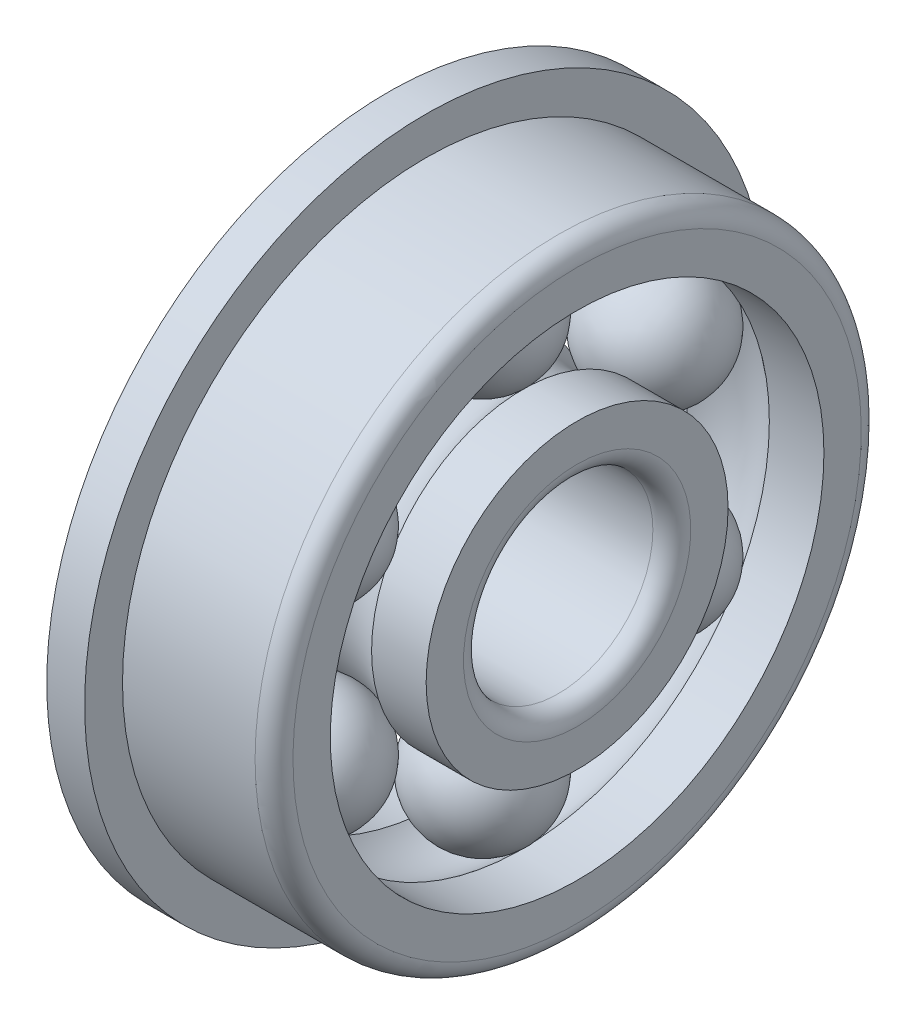
ISO-10303-21;
HEADER;
FILE_DESCRIPTION(('STEP AP214'),'2;1');
FILE_NAME('part.step','',(''),(''),'','','');
FILE_SCHEMA(('AUTOMOTIVE_DESIGN { 1 0 10303 214 1 1 1 1 }'));
ENDSEC;
DATA;
#1=APPLICATION_CONTEXT('core data for automotive mechanical design processes');
#2=APPLICATION_PROTOCOL_DEFINITION('international standard','automotive_design',2000,#1);
#3=PRODUCT_CONTEXT('',#1,'mechanical');
#4=PRODUCT('Part','Part','',(#3));
#5=PRODUCT_RELATED_PRODUCT_CATEGORY('part','',(#4));
#6=PRODUCT_DEFINITION_FORMATION('','',#4);
#7=PRODUCT_DEFINITION_CONTEXT('part definition',#1,'design');
#8=PRODUCT_DEFINITION('design','',#6,#7);
#9=PRODUCT_DEFINITION_SHAPE('','',#8);
#10=(LENGTH_UNIT() NAMED_UNIT(*) SI_UNIT(.MILLI.,.METRE.));
#11=(NAMED_UNIT(*) PLANE_ANGLE_UNIT() SI_UNIT($,.RADIAN.));
#12=(NAMED_UNIT(*) SI_UNIT($,.STERADIAN.) SOLID_ANGLE_UNIT());
#13=UNCERTAINTY_MEASURE_WITH_UNIT(LENGTH_MEASURE(1.E-05),#10,'distance_accuracy_value','');
#14=(GEOMETRIC_REPRESENTATION_CONTEXT(3) GLOBAL_UNCERTAINTY_ASSIGNED_CONTEXT((#13)) GLOBAL_UNIT_ASSIGNED_CONTEXT((#10,
#11,#12)) REPRESENTATION_CONTEXT('',''));
#15=CARTESIAN_POINT('',(0.,0.,0.));
#16=DIRECTION('',(0.,0.,1.));
#17=DIRECTION('',(1.,0.,0.));
#18=AXIS2_PLACEMENT_3D('',#15,#16,#17);
#19=CARTESIAN_POINT('',(0.,2.625,4.54663336986831));
#20=DIRECTION('',(1.,0.,0.));
#21=DIRECTION('',(0.,-0.866025403784439,0.499999999999999));
#22=AXIS2_PLACEMENT_3D('',#19,#20,#21);
#23=SPHERICAL_SURFACE('',#22,1.65);
#24=CARTESIAN_POINT('',(-1.64999999999999,2.625,4.54663336986831));
#25=VERTEX_POINT('',#24);
#26=VERTEX_LOOP('',#25);
#27=FACE_BOUND('',#26,.T.);
#28=CARTESIAN_POINT('',(1.65000000000001,2.625,4.54663336986831));
#29=VERTEX_POINT('',#28);
#30=VERTEX_LOOP('',#29);
#31=FACE_BOUND('',#30,.T.);
#32=ADVANCED_FACE('P0_F15',(#27,#31),#23,.T.);
#33=CLOSED_SHELL('',(#32));
#34=MANIFOLD_SOLID_BREP('P0_B1',#33);
#35=CARTESIAN_POINT('',(0.,-2.625,4.5466333698683));
#36=DIRECTION('',(1.,0.,0.));
#37=DIRECTION('',(0.,-0.866025403784438,-0.5));
#38=AXIS2_PLACEMENT_3D('',#35,#36,#37);
#39=SPHERICAL_SURFACE('',#38,1.65);
#40=CARTESIAN_POINT('',(-1.64999999999999,-2.625,4.5466333698683));
#41=VERTEX_POINT('',#40);
#42=VERTEX_LOOP('',#41);
#43=FACE_BOUND('',#42,.T.);
#44=CARTESIAN_POINT('',(1.65000000000001,-2.625,4.5466333698683));
#45=VERTEX_POINT('',#44);
#46=VERTEX_LOOP('',#45);
#47=FACE_BOUND('',#46,.T.);
#48=ADVANCED_FACE('P1_F15',(#43,#47),#39,.T.);
#49=CLOSED_SHELL('',(#48));
#50=MANIFOLD_SOLID_BREP('P1_B1',#49);
#51=CARTESIAN_POINT('',(0.,-5.25,0.));
#52=DIRECTION('',(1.,0.,0.));
#53=DIRECTION('',(0.,0.,-1.));
#54=AXIS2_PLACEMENT_3D('',#51,#52,#53);
#55=SPHERICAL_SURFACE('',#54,1.65);
#56=CARTESIAN_POINT('',(-1.64999999999999,-5.25,0.));
#57=VERTEX_POINT('',#56);
#58=VERTEX_LOOP('',#57);
#59=FACE_BOUND('',#58,.T.);
#60=CARTESIAN_POINT('',(1.65000000000001,-5.25,0.));
#61=VERTEX_POINT('',#60);
#62=VERTEX_LOOP('',#61);
#63=FACE_BOUND('',#62,.T.);
#64=ADVANCED_FACE('P2_F15',(#59,#63),#55,.T.);
#65=CLOSED_SHELL('',(#64));
#66=MANIFOLD_SOLID_BREP('P2_B1',#65);
#67=CARTESIAN_POINT('',(0.,-2.625,-4.5466333698683));
#68=DIRECTION('',(1.,0.,0.));
#69=DIRECTION('',(0.,0.866025403784439,-0.5));
#70=AXIS2_PLACEMENT_3D('',#67,#68,#69);
#71=SPHERICAL_SURFACE('',#70,1.65);
#72=CARTESIAN_POINT('',(-1.64999999999999,-2.625,-4.5466333698683));
#73=VERTEX_POINT('',#72);
#74=VERTEX_LOOP('',#73);
#75=FACE_BOUND('',#74,.T.);
#76=CARTESIAN_POINT('',(1.65000000000001,-2.625,-4.5466333698683));
#77=VERTEX_POINT('',#76);
#78=VERTEX_LOOP('',#77);
#79=FACE_BOUND('',#78,.T.);
#80=ADVANCED_FACE('P3_F15',(#75,#79),#71,.T.);
#81=CLOSED_SHELL('',(#80));
#82=MANIFOLD_SOLID_BREP('P3_B1',#81);
#83=CARTESIAN_POINT('',(0.,2.625,-4.5466333698683));
#84=DIRECTION('',(1.,0.,0.));
#85=DIRECTION('',(0.,0.866025403784439,0.5));
#86=AXIS2_PLACEMENT_3D('',#83,#84,#85);
#87=SPHERICAL_SURFACE('',#86,1.65);
#88=CARTESIAN_POINT('',(-1.64999999999999,2.625,-4.5466333698683));
#89=VERTEX_POINT('',#88);
#90=VERTEX_LOOP('',#89);
#91=FACE_BOUND('',#90,.T.);
#92=CARTESIAN_POINT('',(1.65000000000001,2.625,-4.5466333698683));
#93=VERTEX_POINT('',#92);
#94=VERTEX_LOOP('',#93);
#95=FACE_BOUND('',#94,.T.);
#96=ADVANCED_FACE('P4_F15',(#91,#95),#87,.T.);
#97=CLOSED_SHELL('',(#96));
#98=MANIFOLD_SOLID_BREP('P4_B1',#97);
#99=CARTESIAN_POINT('',(0.,5.25,0.));
#100=DIRECTION('',(1.,0.,0.));
#101=DIRECTION('',(0.,0.,1.));
#102=AXIS2_PLACEMENT_3D('',#99,#100,#101);
#103=SPHERICAL_SURFACE('',#102,1.65);
#104=CARTESIAN_POINT('',(-1.64999999999999,5.25,0.));
#105=VERTEX_POINT('',#104);
#106=VERTEX_LOOP('',#105);
#107=FACE_BOUND('',#106,.T.);
#108=CARTESIAN_POINT('',(1.65000000000001,5.25,0.));
#109=VERTEX_POINT('',#108);
#110=VERTEX_LOOP('',#109);
#111=FACE_BOUND('',#110,.T.);
#112=ADVANCED_FACE('P5_F15',(#107,#111),#103,.T.);
#113=CLOSED_SHELL('',(#112));
#114=MANIFOLD_SOLID_BREP('P5_B1',#113);
#115=CARTESIAN_POINT('',(0.,0.,0.));
#116=DIRECTION('',(1.,0.,0.));
#117=DIRECTION('',(0.,1.,0.));
#118=AXIS2_PLACEMENT_3D('',#115,#116,#117);
#119=TOROIDAL_SURFACE('',#118,5.25,1.65);
#120=CARTESIAN_POINT('',(-1.0593748156342,0.,0.));
#121=DIRECTION('',(1.,0.,0.));
#122=DIRECTION('',(0.,0.,-1.));
#123=AXIS2_PLACEMENT_3D('',#120,#121,#122);
#124=CIRCLE('',#123,6.515);
#125=CARTESIAN_POINT('',(-1.0593748156342,0.,-6.515));
#126=VERTEX_POINT('',#125);
#127=EDGE_CURVE('P6_E46',#126,#126,#124,.F.);
#128=ORIENTED_EDGE('',*,*,#127,.T.);
#129=EDGE_LOOP('',(#128));
#130=FACE_BOUND('',#129,.T.);
#131=CARTESIAN_POINT('',(1.0593748156342,0.,0.));
#132=DIRECTION('',(1.,0.,0.));
#133=DIRECTION('',(0.,0.,-1.));
#134=AXIS2_PLACEMENT_3D('',#131,#132,#133);
#135=CIRCLE('',#134,6.515);
#136=CARTESIAN_POINT('',(1.0593748156342,0.,-6.515));
#137=VERTEX_POINT('',#136);
#138=EDGE_CURVE('P6_E42',#137,#137,#135,.T.);
#139=ORIENTED_EDGE('',*,*,#138,.T.);
#140=EDGE_LOOP('',(#139));
#141=FACE_BOUND('',#140,.T.);
#142=ADVANCED_FACE('P6_F14',(#130,#141),#119,.F.);
#143=CARTESIAN_POINT('',(2.50000000000003,0.,0.));
#144=DIRECTION('',(1.,0.,0.));
#145=DIRECTION('',(0.,0.,-1.));
#146=AXIS2_PLACEMENT_3D('',#143,#144,#145);
#147=CYLINDRICAL_SURFACE('',#146,6.515);
#148=CARTESIAN_POINT('',(-2.49999999999998,0.,0.));
#149=DIRECTION('',(1.,0.,0.));
#150=DIRECTION('',(0.,0.,-1.));
#151=AXIS2_PLACEMENT_3D('',#148,#149,#150);
#152=CIRCLE('',#151,6.515);
#153=CARTESIAN_POINT('',(-2.49999999999998,0.,-6.515));
#154=VERTEX_POINT('',#153);
#155=EDGE_CURVE('P6_E18',#154,#154,#152,.T.);
#156=ORIENTED_EDGE('',*,*,#155,.F.);
#157=EDGE_LOOP('',(#156));
#158=FACE_BOUND('',#157,.T.);
#159=ORIENTED_EDGE('',*,*,#127,.F.);
#160=EDGE_LOOP('',(#159));
#161=FACE_BOUND('',#160,.T.);
#162=ADVANCED_FACE('P6_F100',(#158,#161),#147,.F.);
#163=CARTESIAN_POINT('',(2.50000000000003,0.,0.));
#164=DIRECTION('',(1.,0.,0.));
#165=DIRECTION('',(0.,0.,-1.));
#166=AXIS2_PLACEMENT_3D('',#163,#164,#165);
#167=CYLINDRICAL_SURFACE('',#166,6.515);
#168=ORIENTED_EDGE('',*,*,#138,.F.);
#169=EDGE_LOOP('',(#168));
#170=FACE_BOUND('',#169,.T.);
#171=CARTESIAN_POINT('',(2.50000000000003,0.,0.));
#172=DIRECTION('',(1.,0.,0.));
#173=DIRECTION('',(0.,0.,-1.));
#174=AXIS2_PLACEMENT_3D('',#171,#172,#173);
#175=CIRCLE('',#174,6.515);
#176=CARTESIAN_POINT('',(2.50000000000003,0.,-6.515));
#177=VERTEX_POINT('',#176);
#178=EDGE_CURVE('P6_E37',#177,#177,#175,.F.);
#179=ORIENTED_EDGE('',*,*,#178,.F.);
#180=EDGE_LOOP('',(#179));
#181=FACE_BOUND('',#180,.T.);
#182=ADVANCED_FACE('P6_F98',(#170,#181),#167,.F.);
#183=CARTESIAN_POINT('',(-2.49999999999998,0.,0.));
#184=DIRECTION('',(-1.,0.,0.));
#185=DIRECTION('',(0.,0.,1.));
#186=AXIS2_PLACEMENT_3D('',#183,#184,#185);
#187=PLANE('',#186);
#188=ORIENTED_EDGE('',*,*,#155,.T.);
#189=EDGE_LOOP('',(#188));
#190=FACE_BOUND('',#189,.T.);
#191=CARTESIAN_POINT('',(-2.49999999999999,0.,0.));
#192=DIRECTION('',(1.,0.,0.));
#193=DIRECTION('',(0.,0.,-1.));
#194=AXIS2_PLACEMENT_3D('',#191,#192,#193);
#195=CIRCLE('',#194,9.00000000000001);
#196=CARTESIAN_POINT('',(-2.49999999999999,0.,-9.00000000000001));
#197=VERTEX_POINT('',#196);
#198=EDGE_CURVE('P6_E35',#197,#197,#195,.T.);
#199=ORIENTED_EDGE('',*,*,#198,.F.);
#200=EDGE_LOOP('',(#199));
#201=FACE_BOUND('',#200,.T.);
#202=ADVANCED_FACE('P6_F95',(#190,#201),#187,.T.);
#203=CARTESIAN_POINT('',(2.50000000000003,0.,0.));
#204=DIRECTION('',(1.,0.,0.));
#205=DIRECTION('',(0.,0.,-1.));
#206=AXIS2_PLACEMENT_3D('',#203,#204,#205);
#207=PLANE('',#206);
#208=ORIENTED_EDGE('',*,*,#178,.T.);
#209=EDGE_LOOP('',(#208));
#210=FACE_BOUND('',#209,.T.);
#211=CARTESIAN_POINT('',(2.50000000000003,0.,0.));
#212=DIRECTION('',(-1.,0.,0.));
#213=DIRECTION('',(0.,1.,0.));
#214=AXIS2_PLACEMENT_3D('',#211,#212,#213);
#215=CIRCLE('',#214,7.49999999999999);
#216=CARTESIAN_POINT('',(2.50000000000003,7.49999999999999,0.));
#217=VERTEX_POINT('',#216);
#218=EDGE_CURVE('P6_E34',#217,#217,#215,.T.);
#219=ORIENTED_EDGE('',*,*,#218,.F.);
#220=EDGE_LOOP('',(#219));
#221=FACE_BOUND('',#220,.T.);
#222=ADVANCED_FACE('P6_F86',(#210,#221),#207,.T.);
#223=CARTESIAN_POINT('',(-2.49999999999999,0.,0.));
#224=DIRECTION('',(1.,0.,0.));
#225=DIRECTION('',(0.,0.,-1.));
#226=AXIS2_PLACEMENT_3D('',#223,#224,#225);
#227=CYLINDRICAL_SURFACE('',#226,9.00000000000001);
#228=ORIENTED_EDGE('',*,*,#198,.T.);
#229=EDGE_LOOP('',(#228));
#230=FACE_BOUND('',#229,.T.);
#231=CARTESIAN_POINT('',(-1.49999999999999,0.,0.));
#232=DIRECTION('',(1.,0.,0.));
#233=DIRECTION('',(0.,0.,-1.));
#234=AXIS2_PLACEMENT_3D('',#231,#232,#233);
#235=CIRCLE('',#234,9.00000000000001);
#236=CARTESIAN_POINT('',(-1.49999999999999,0.,-9.00000000000001));
#237=VERTEX_POINT('',#236);
#238=EDGE_CURVE('P6_E27',#237,#237,#235,.T.);
#239=ORIENTED_EDGE('',*,*,#238,.F.);
#240=EDGE_LOOP('',(#239));
#241=FACE_BOUND('',#240,.T.);
#242=ADVANCED_FACE('P6_F74',(#230,#241),#227,.T.);
#243=CARTESIAN_POINT('',(2.00000000000003,0.,0.));
#244=DIRECTION('',(1.,0.,0.));
#245=DIRECTION('',(0.,1.,0.));
#246=AXIS2_PLACEMENT_3D('',#243,#244,#245);
#247=TOROIDAL_SURFACE('',#246,7.49999999999999,0.5);
#248=CARTESIAN_POINT('',(2.00000000000003,0.,0.));
#249=DIRECTION('',(1.,0.,0.));
#250=DIRECTION('',(0.,0.,-1.));
#251=AXIS2_PLACEMENT_3D('',#248,#249,#250);
#252=CIRCLE('',#251,7.99999999999999);
#253=CARTESIAN_POINT('',(2.00000000000003,0.,-7.99999999999999));
#254=VERTEX_POINT('',#253);
#255=EDGE_CURVE('P6_E22',#254,#254,#252,.F.);
#256=ORIENTED_EDGE('',*,*,#255,.F.);
#257=EDGE_LOOP('',(#256));
#258=FACE_BOUND('',#257,.T.);
#259=ORIENTED_EDGE('',*,*,#218,.T.);
#260=EDGE_LOOP('',(#259));
#261=FACE_BOUND('',#260,.T.);
#262=ADVANCED_FACE('P6_F62',(#258,#261),#247,.T.);
#263=CARTESIAN_POINT('',(-1.49999999999999,0.,0.));
#264=DIRECTION('',(1.,0.,0.));
#265=DIRECTION('',(0.,0.,-1.));
#266=AXIS2_PLACEMENT_3D('',#263,#264,#265);
#267=PLANE('',#266);
#268=CARTESIAN_POINT('',(-1.49999999999999,0.,0.));
#269=DIRECTION('',(1.,0.,0.));
#270=DIRECTION('',(0.,0.,-1.));
#271=AXIS2_PLACEMENT_3D('',#268,#269,#270);
#272=CIRCLE('',#271,7.99999999999999);
#273=CARTESIAN_POINT('',(-1.49999999999999,0.,-7.99999999999999));
#274=VERTEX_POINT('',#273);
#275=EDGE_CURVE('P6_E10',#274,#274,#272,.T.);
#276=ORIENTED_EDGE('',*,*,#275,.F.);
#277=EDGE_LOOP('',(#276));
#278=FACE_BOUND('',#277,.T.);
#279=ORIENTED_EDGE('',*,*,#238,.T.);
#280=EDGE_LOOP('',(#279));
#281=FACE_BOUND('',#280,.T.);
#282=ADVANCED_FACE('P6_F73',(#278,#281),#267,.T.);
#283=CARTESIAN_POINT('',(-2.49999999999998,0.,0.));
#284=DIRECTION('',(1.,0.,0.));
#285=DIRECTION('',(0.,0.,-1.));
#286=AXIS2_PLACEMENT_3D('',#283,#284,#285);
#287=CYLINDRICAL_SURFACE('',#286,7.99999999999999);
#288=ORIENTED_EDGE('',*,*,#275,.T.);
#289=EDGE_LOOP('',(#288));
#290=FACE_BOUND('',#289,.T.);
#291=ORIENTED_EDGE('',*,*,#255,.T.);
#292=EDGE_LOOP('',(#291));
#293=FACE_BOUND('',#292,.T.);
#294=ADVANCED_FACE('P6_F110',(#290,#293),#287,.T.);
#295=CLOSED_SHELL('',(#142,#162,#182,#202,#222,#242,#262,#282,#294));
#296=MANIFOLD_SOLID_BREP('P6_B1',#295);
#297=CARTESIAN_POINT('',(0.,0.,0.));
#298=DIRECTION('',(1.,0.,0.));
#299=DIRECTION('',(0.,1.,0.));
#300=AXIS2_PLACEMENT_3D('',#297,#298,#299);
#301=TOROIDAL_SURFACE('',#300,5.25,1.65);
#302=CARTESIAN_POINT('',(-1.05937481563419,0.,0.));
#303=DIRECTION('',(1.,0.,0.));
#304=DIRECTION('',(0.,0.,-1.));
#305=AXIS2_PLACEMENT_3D('',#302,#303,#304);
#306=CIRCLE('',#305,3.98499999999999);
#307=CARTESIAN_POINT('',(-1.05937481563419,0.,-3.98499999999999));
#308=VERTEX_POINT('',#307);
#309=EDGE_CURVE('P7_E109',#308,#308,#306,.F.);
#310=ORIENTED_EDGE('',*,*,#309,.F.);
#311=EDGE_LOOP('',(#310));
#312=FACE_BOUND('',#311,.T.);
#313=CARTESIAN_POINT('',(1.05937481563419,0.,0.));
#314=DIRECTION('',(1.,0.,0.));
#315=DIRECTION('',(0.,0.,-1.));
#316=AXIS2_PLACEMENT_3D('',#313,#314,#315);
#317=CIRCLE('',#316,3.98499999999999);
#318=CARTESIAN_POINT('',(1.05937481563419,0.,-3.98499999999999));
#319=VERTEX_POINT('',#318);
#320=EDGE_CURVE('P7_E114',#319,#319,#317,.T.);
#321=ORIENTED_EDGE('',*,*,#320,.F.);
#322=EDGE_LOOP('',(#321));
#323=FACE_BOUND('',#322,.T.);
#324=ADVANCED_FACE('P7_F14',(#312,#323),#301,.F.);
#325=CARTESIAN_POINT('',(-2.49999999999999,0.,0.));
#326=DIRECTION('',(1.,0.,0.));
#327=DIRECTION('',(0.,0.,-1.));
#328=AXIS2_PLACEMENT_3D('',#325,#326,#327);
#329=CYLINDRICAL_SURFACE('',#328,3.98499999999999);
#330=ORIENTED_EDGE('',*,*,#320,.T.);
#331=EDGE_LOOP('',(#330));
#332=FACE_BOUND('',#331,.T.);
#333=CARTESIAN_POINT('',(2.5,0.,0.));
#334=DIRECTION('',(1.,0.,0.));
#335=DIRECTION('',(0.,0.,-1.));
#336=AXIS2_PLACEMENT_3D('',#333,#334,#335);
#337=CIRCLE('',#336,3.98499999999999);
#338=CARTESIAN_POINT('',(2.5,0.,-3.98499999999999));
#339=VERTEX_POINT('',#338);
#340=EDGE_CURVE('P7_E18',#339,#339,#337,.T.);
#341=ORIENTED_EDGE('',*,*,#340,.F.);
#342=EDGE_LOOP('',(#341));
#343=FACE_BOUND('',#342,.T.);
#344=ADVANCED_FACE('P7_F84',(#332,#343),#329,.T.);
#345=CARTESIAN_POINT('',(-2.49999999999999,0.,0.));
#346=DIRECTION('',(1.,0.,0.));
#347=DIRECTION('',(0.,0.,-1.));
#348=AXIS2_PLACEMENT_3D('',#345,#346,#347);
#349=CYLINDRICAL_SURFACE('',#348,3.98499999999999);
#350=CARTESIAN_POINT('',(-2.49999999999999,0.,0.));
#351=DIRECTION('',(1.,0.,0.));
#352=DIRECTION('',(0.,0.,-1.));
#353=AXIS2_PLACEMENT_3D('',#350,#351,#352);
#354=CIRCLE('',#353,3.98499999999999);
#355=CARTESIAN_POINT('',(-2.49999999999999,0.,-3.98499999999999));
#356=VERTEX_POINT('',#355);
#357=EDGE_CURVE('P7_E104',#356,#356,#354,.F.);
#358=ORIENTED_EDGE('',*,*,#357,.F.);
#359=EDGE_LOOP('',(#358));
#360=FACE_BOUND('',#359,.T.);
#361=ORIENTED_EDGE('',*,*,#309,.T.);
#362=EDGE_LOOP('',(#361));
#363=FACE_BOUND('',#362,.T.);
#364=ADVANCED_FACE('P7_F81',(#360,#363),#349,.T.);
#365=CARTESIAN_POINT('',(2.50000000000001,0.,0.));
#366=DIRECTION('',(1.,0.,0.));
#367=DIRECTION('',(0.,0.,-1.));
#368=AXIS2_PLACEMENT_3D('',#365,#366,#367);
#369=PLANE('',#368);
#370=CARTESIAN_POINT('',(2.50000000000001,0.,0.));
#371=DIRECTION('',(1.,0.,0.));
#372=DIRECTION('',(0.,1.,0.));
#373=AXIS2_PLACEMENT_3D('',#370,#371,#372);
#374=CIRCLE('',#373,3.);
#375=CARTESIAN_POINT('',(2.50000000000001,3.,0.));
#376=VERTEX_POINT('',#375);
#377=EDGE_CURVE('P7_E65',#376,#376,#374,.T.);
#378=ORIENTED_EDGE('',*,*,#377,.F.);
#379=EDGE_LOOP('',(#378));
#380=FACE_BOUND('',#379,.T.);
#381=ORIENTED_EDGE('',*,*,#340,.T.);
#382=EDGE_LOOP('',(#381));
#383=FACE_BOUND('',#382,.T.);
#384=ADVANCED_FACE('P7_F71',(#380,#383),#369,.T.);
#385=CARTESIAN_POINT('',(-2.49999999999999,0.,0.));
#386=DIRECTION('',(-1.,0.,0.));
#387=DIRECTION('',(0.,0.,1.));
#388=AXIS2_PLACEMENT_3D('',#385,#386,#387);
#389=PLANE('',#388);
#390=CARTESIAN_POINT('',(-2.49999999999999,0.,0.));
#391=DIRECTION('',(-1.,0.,0.));
#392=DIRECTION('',(0.,1.,0.));
#393=AXIS2_PLACEMENT_3D('',#390,#391,#392);
#394=CIRCLE('',#393,3.);
#395=CARTESIAN_POINT('',(-2.49999999999999,3.,0.));
#396=VERTEX_POINT('',#395);
#397=EDGE_CURVE('P7_E27',#396,#396,#394,.T.);
#398=ORIENTED_EDGE('',*,*,#397,.F.);
#399=EDGE_LOOP('',(#398));
#400=FACE_BOUND('',#399,.T.);
#401=ORIENTED_EDGE('',*,*,#357,.T.);
#402=EDGE_LOOP('',(#401));
#403=FACE_BOUND('',#402,.T.);
#404=ADVANCED_FACE('P7_F80',(#400,#403),#389,.T.);
#405=CARTESIAN_POINT('',(2.00000000000001,0.,0.));
#406=DIRECTION('',(1.,0.,0.));
#407=DIRECTION('',(0.,1.,0.));
#408=AXIS2_PLACEMENT_3D('',#405,#406,#407);
#409=TOROIDAL_SURFACE('',#408,3.,0.5);
#410=CARTESIAN_POINT('',(2.00000000000001,0.,0.));
#411=DIRECTION('',(1.,0.,0.));
#412=DIRECTION('',(0.,0.,-1.));
#413=AXIS2_PLACEMENT_3D('',#410,#411,#412);
#414=CIRCLE('',#413,2.5);
#415=CARTESIAN_POINT('',(2.00000000000001,0.,-2.5));
#416=VERTEX_POINT('',#415);
#417=EDGE_CURVE('P7_E22',#416,#416,#414,.F.);
#418=ORIENTED_EDGE('',*,*,#417,.T.);
#419=EDGE_LOOP('',(#418));
#420=FACE_BOUND('',#419,.T.);
#421=ORIENTED_EDGE('',*,*,#377,.T.);
#422=EDGE_LOOP('',(#421));
#423=FACE_BOUND('',#422,.T.);
#424=ADVANCED_FACE('P7_F45',(#420,#423),#409,.T.);
#425=CARTESIAN_POINT('',(-1.99999999999999,0.,0.));
#426=DIRECTION('',(1.,0.,0.));
#427=DIRECTION('',(0.,1.,0.));
#428=AXIS2_PLACEMENT_3D('',#425,#426,#427);
#429=TOROIDAL_SURFACE('',#428,3.,0.5);
#430=ORIENTED_EDGE('',*,*,#397,.T.);
#431=EDGE_LOOP('',(#430));
#432=FACE_BOUND('',#431,.T.);
#433=CARTESIAN_POINT('',(-1.99999999999999,0.,0.));
#434=DIRECTION('',(1.,0.,0.));
#435=DIRECTION('',(0.,0.,-1.));
#436=AXIS2_PLACEMENT_3D('',#433,#434,#435);
#437=CIRCLE('',#436,2.5);
#438=CARTESIAN_POINT('',(-1.99999999999999,0.,-2.5));
#439=VERTEX_POINT('',#438);
#440=EDGE_CURVE('P7_E10',#439,#439,#437,.T.);
#441=ORIENTED_EDGE('',*,*,#440,.T.);
#442=EDGE_LOOP('',(#441));
#443=FACE_BOUND('',#442,.T.);
#444=ADVANCED_FACE('P7_F39',(#432,#443),#429,.T.);
#445=CARTESIAN_POINT('',(2.50000000000001,0.,0.));
#446=DIRECTION('',(1.,0.,0.));
#447=DIRECTION('',(0.,0.,-1.));
#448=AXIS2_PLACEMENT_3D('',#445,#446,#447);
#449=CYLINDRICAL_SURFACE('',#448,2.5);
#450=ORIENTED_EDGE('',*,*,#440,.F.);
#451=EDGE_LOOP('',(#450));
#452=FACE_BOUND('',#451,.T.);
#453=ORIENTED_EDGE('',*,*,#417,.F.);
#454=EDGE_LOOP('',(#453));
#455=FACE_BOUND('',#454,.T.);
#456=ADVANCED_FACE('P7_F44',(#452,#455),#449,.F.);
#457=CLOSED_SHELL('',(#324,#344,#364,#384,#404,#424,#444,#456));
#458=MANIFOLD_SOLID_BREP('P7_B1',#457);
#459=ADVANCED_BREP_SHAPE_REPRESENTATION('',(#18,#34,#50,#66,#82,#98,#114,#296,#458),#14);
#460=SHAPE_DEFINITION_REPRESENTATION(#9,#459);
ENDSEC;
END-ISO-10303-21;
